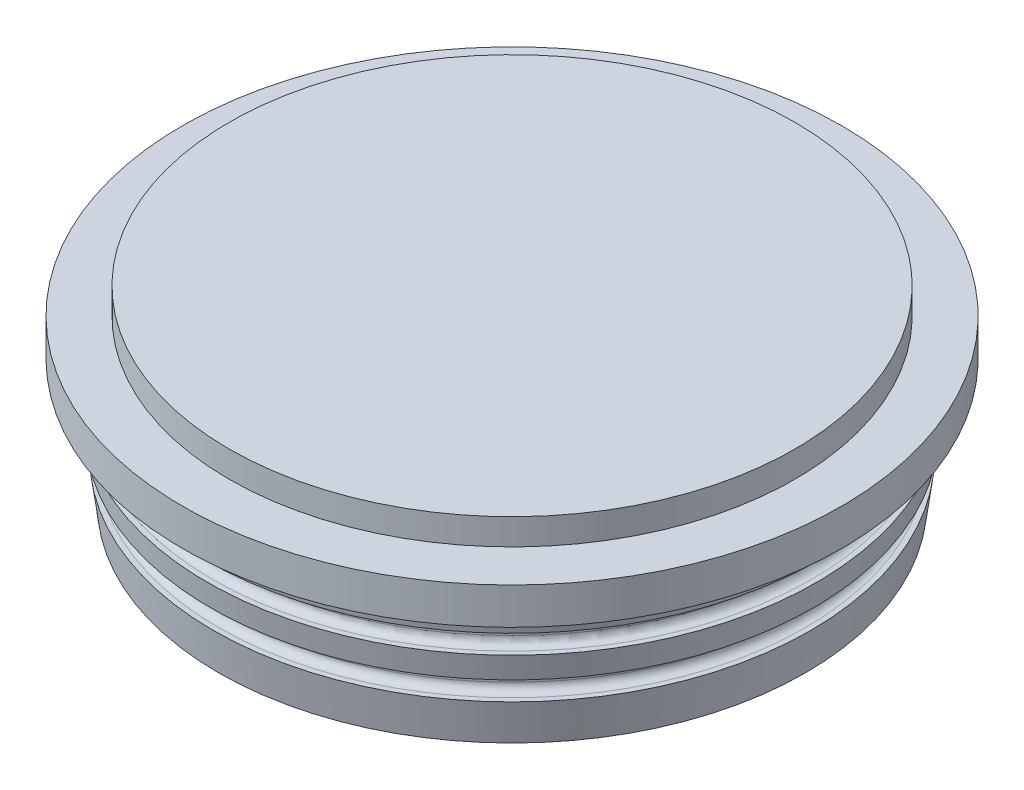
ISO-10303-21;
HEADER;
FILE_DESCRIPTION(('STEP AP214'),'2;1');
FILE_NAME('part.step','',(''),(''),'','','');
FILE_SCHEMA(('AUTOMOTIVE_DESIGN { 1 0 10303 214 1 1 1 1 }'));
ENDSEC;
DATA;
#1=APPLICATION_CONTEXT('core data for automotive mechanical design processes');
#2=APPLICATION_PROTOCOL_DEFINITION('international standard','automotive_design',2000,#1);
#3=PRODUCT_CONTEXT('',#1,'mechanical');
#4=PRODUCT('Part','Part','',(#3));
#5=PRODUCT_RELATED_PRODUCT_CATEGORY('part','',(#4));
#6=PRODUCT_DEFINITION_FORMATION('','',#4);
#7=PRODUCT_DEFINITION_CONTEXT('part definition',#1,'design');
#8=PRODUCT_DEFINITION('design','',#6,#7);
#9=PRODUCT_DEFINITION_SHAPE('','',#8);
#10=(LENGTH_UNIT() NAMED_UNIT(*) SI_UNIT(.MILLI.,.METRE.));
#11=(NAMED_UNIT(*) PLANE_ANGLE_UNIT() SI_UNIT($,.RADIAN.));
#12=(NAMED_UNIT(*) SI_UNIT($,.STERADIAN.) SOLID_ANGLE_UNIT());
#13=UNCERTAINTY_MEASURE_WITH_UNIT(LENGTH_MEASURE(1.E-05),#10,'distance_accuracy_value','');
#14=(GEOMETRIC_REPRESENTATION_CONTEXT(3) GLOBAL_UNCERTAINTY_ASSIGNED_CONTEXT((#13)) GLOBAL_UNIT_ASSIGNED_CONTEXT((#10,
#11,#12)) REPRESENTATION_CONTEXT('',''));
#15=CARTESIAN_POINT('',(0.,0.,0.));
#16=DIRECTION('',(0.,0.,1.));
#17=DIRECTION('',(1.,0.,0.));
#18=AXIS2_PLACEMENT_3D('',#15,#16,#17);
#19=CARTESIAN_POINT('',(0.,-31.,0.));
#20=DIRECTION('',(0.,1.,0.));
#21=DIRECTION('',(0.,0.,1.));
#22=AXIS2_PLACEMENT_3D('',#19,#20,#21);
#23=CONICAL_SURFACE('',#22,56.,0.130899693899576);
#24=CARTESIAN_POINT('',(0.,-23.5,0.));
#25=DIRECTION('',(0.,-1.,0.));
#26=DIRECTION('',(0.,0.,-1.));
#27=AXIS2_PLACEMENT_3D('',#24,#25,#26);
#28=CIRCLE('',#27,56.9873937319055);
#29=CARTESIAN_POINT('',(0.,-23.5,-56.9873937319055));
#30=VERTEX_POINT('',#29);
#31=EDGE_CURVE('E75',#30,#30,#28,.T.);
#32=ORIENTED_EDGE('',*,*,#31,.T.);
#33=EDGE_LOOP('',(#32));
#34=FACE_BOUND('',#33,.T.);
#35=CARTESIAN_POINT('',(0.,-31.,0.));
#36=DIRECTION('',(0.,-1.,0.));
#37=DIRECTION('',(0.,0.,-1.));
#38=AXIS2_PLACEMENT_3D('',#35,#36,#37);
#39=CIRCLE('',#38,56.);
#40=CARTESIAN_POINT('',(0.,-31.,-56.));
#41=VERTEX_POINT('',#40);
#42=EDGE_CURVE('E105',#41,#41,#39,.T.);
#43=ORIENTED_EDGE('',*,*,#42,.F.);
#44=EDGE_LOOP('',(#43));
#45=FACE_BOUND('',#44,.T.);
#46=ADVANCED_FACE('F37',(#34,#45),#23,.T.);
#47=CARTESIAN_POINT('',(56.9873937319055,-23.5,0.));
#48=DIRECTION('',(0.,1.,0.));
#49=DIRECTION('',(0.,0.,1.));
#50=AXIS2_PLACEMENT_3D('',#47,#48,#49);
#51=PLANE('',#50);
#52=CARTESIAN_POINT('',(0.,-23.5,0.));
#53=DIRECTION('',(0.,1.,0.));
#54=DIRECTION('',(0.,0.,1.));
#55=AXIS2_PLACEMENT_3D('',#52,#53,#54);
#56=CIRCLE('',#55,56.0140037222551);
#57=CARTESIAN_POINT('',(0.,-23.5,56.0140037222551));
#58=VERTEX_POINT('',#57);
#59=EDGE_CURVE('E63',#58,#58,#56,.F.);
#60=ORIENTED_EDGE('',*,*,#59,.T.);
#61=EDGE_LOOP('',(#60));
#62=FACE_BOUND('',#61,.T.);
#63=ORIENTED_EDGE('',*,*,#31,.F.);
#64=EDGE_LOOP('',(#63));
#65=FACE_BOUND('',#64,.T.);
#66=ADVANCED_FACE('F113',(#62,#65),#51,.T.);
#67=CARTESIAN_POINT('',(0.,0.,0.));
#68=DIRECTION('',(0.,-1.,0.));
#69=DIRECTION('',(0.,0.,-1.));
#70=AXIS2_PLACEMENT_3D('',#67,#68,#69);
#71=CYLINDRICAL_SURFACE('',#70,54.5140037222551);
#72=CARTESIAN_POINT('',(0.,-22.,0.));
#73=DIRECTION('',(0.,1.,0.));
#74=DIRECTION('',(0.,0.,1.));
#75=AXIS2_PLACEMENT_3D('',#72,#73,#74);
#76=CIRCLE('',#75,54.5140037222551);
#77=CARTESIAN_POINT('',(0.,-22.,54.5140037222551));
#78=VERTEX_POINT('',#77);
#79=EDGE_CURVE('E57',#78,#78,#76,.T.);
#80=ORIENTED_EDGE('',*,*,#79,.T.);
#81=EDGE_LOOP('',(#80));
#82=FACE_BOUND('',#81,.T.);
#83=CARTESIAN_POINT('',(0.,-21.,0.));
#84=DIRECTION('',(0.,-1.,0.));
#85=DIRECTION('',(0.,0.,-1.));
#86=AXIS2_PLACEMENT_3D('',#83,#84,#85);
#87=CIRCLE('',#86,54.5140037222551);
#88=CARTESIAN_POINT('',(0.,-21.,-54.5140037222551));
#89=VERTEX_POINT('',#88);
#90=EDGE_CURVE('E60',#89,#89,#87,.T.);
#91=ORIENTED_EDGE('',*,*,#90,.T.);
#92=EDGE_LOOP('',(#91));
#93=FACE_BOUND('',#92,.T.);
#94=ADVANCED_FACE('F119',(#82,#93),#71,.T.);
#95=CARTESIAN_POINT('',(54.5140037222551,-19.5,0.));
#96=DIRECTION('',(0.,-1.,0.));
#97=DIRECTION('',(0.,0.,-1.));
#98=AXIS2_PLACEMENT_3D('',#95,#96,#97);
#99=PLANE('',#98);
#100=CARTESIAN_POINT('',(0.,-19.5,0.));
#101=DIRECTION('',(0.,-1.,0.));
#102=DIRECTION('',(0.,0.,-1.));
#103=AXIS2_PLACEMENT_3D('',#100,#101,#102);
#104=CIRCLE('',#103,56.0140037222551);
#105=CARTESIAN_POINT('',(0.,-19.5,-56.0140037222551));
#106=VERTEX_POINT('',#105);
#107=EDGE_CURVE('E52',#106,#106,#104,.F.);
#108=ORIENTED_EDGE('',*,*,#107,.T.);
#109=EDGE_LOOP('',(#108));
#110=FACE_BOUND('',#109,.T.);
#111=CARTESIAN_POINT('',(0.,-19.5,0.));
#112=DIRECTION('',(0.,-1.,0.));
#113=DIRECTION('',(0.,0.,-1.));
#114=AXIS2_PLACEMENT_3D('',#111,#112,#113);
#115=CIRCLE('',#114,57.5140037222551);
#116=CARTESIAN_POINT('',(0.,-19.5,-57.5140037222551));
#117=VERTEX_POINT('',#116);
#118=EDGE_CURVE('E78',#117,#117,#115,.T.);
#119=ORIENTED_EDGE('',*,*,#118,.T.);
#120=EDGE_LOOP('',(#119));
#121=FACE_BOUND('',#120,.T.);
#122=ADVANCED_FACE('F166',(#110,#121),#99,.T.);
#123=CARTESIAN_POINT('',(0.,-19.5,0.));
#124=DIRECTION('',(0.,1.,0.));
#125=DIRECTION('',(0.,0.,1.));
#126=AXIS2_PLACEMENT_3D('',#123,#124,#125);
#127=CONICAL_SURFACE('',#126,57.5140037222551,0.130899693899575);
#128=CARTESIAN_POINT('',(0.,-15.,0.));
#129=DIRECTION('',(0.,-1.,0.));
#130=DIRECTION('',(0.,0.,-1.));
#131=AXIS2_PLACEMENT_3D('',#128,#129,#130);
#132=CIRCLE('',#131,58.1064399613983);
#133=CARTESIAN_POINT('',(0.,-15.,-58.1064399613983));
#134=VERTEX_POINT('',#133);
#135=EDGE_CURVE('E81',#134,#134,#132,.T.);
#136=ORIENTED_EDGE('',*,*,#135,.T.);
#137=EDGE_LOOP('',(#136));
#138=FACE_BOUND('',#137,.T.);
#139=ORIENTED_EDGE('',*,*,#118,.F.);
#140=EDGE_LOOP('',(#139));
#141=FACE_BOUND('',#140,.T.);
#142=ADVANCED_FACE('F159',(#138,#141),#127,.T.);
#143=CARTESIAN_POINT('',(58.1064399613983,-15.,0.));
#144=DIRECTION('',(0.,1.,0.));
#145=DIRECTION('',(0.,0.,1.));
#146=AXIS2_PLACEMENT_3D('',#143,#144,#145);
#147=PLANE('',#146);
#148=CARTESIAN_POINT('',(0.,-15.,0.));
#149=DIRECTION('',(0.,1.,0.));
#150=DIRECTION('',(0.,0.,1.));
#151=AXIS2_PLACEMENT_3D('',#148,#149,#150);
#152=CIRCLE('',#151,57.1330499517479);
#153=CARTESIAN_POINT('',(0.,-15.,57.1330499517479));
#154=VERTEX_POINT('',#153);
#155=EDGE_CURVE('E72',#154,#154,#152,.F.);
#156=ORIENTED_EDGE('',*,*,#155,.T.);
#157=EDGE_LOOP('',(#156));
#158=FACE_BOUND('',#157,.T.);
#159=ORIENTED_EDGE('',*,*,#135,.F.);
#160=EDGE_LOOP('',(#159));
#161=FACE_BOUND('',#160,.T.);
#162=ADVANCED_FACE('F149',(#158,#161),#147,.T.);
#163=CARTESIAN_POINT('',(0.,0.,0.));
#164=DIRECTION('',(0.,-1.,0.));
#165=DIRECTION('',(0.,0.,-1.));
#166=AXIS2_PLACEMENT_3D('',#163,#164,#165);
#167=CYLINDRICAL_SURFACE('',#166,55.6330499517479);
#168=CARTESIAN_POINT('',(0.,-13.5,0.));
#169=DIRECTION('',(0.,1.,0.));
#170=DIRECTION('',(0.,0.,1.));
#171=AXIS2_PLACEMENT_3D('',#168,#169,#170);
#172=CIRCLE('',#171,55.6330499517479);
#173=CARTESIAN_POINT('',(0.,-13.5,55.6330499517479));
#174=VERTEX_POINT('',#173);
#175=EDGE_CURVE('E66',#174,#174,#172,.T.);
#176=ORIENTED_EDGE('',*,*,#175,.T.);
#177=EDGE_LOOP('',(#176));
#178=FACE_BOUND('',#177,.T.);
#179=CARTESIAN_POINT('',(0.,-12.5,0.));
#180=DIRECTION('',(0.,-1.,0.));
#181=DIRECTION('',(0.,0.,-1.));
#182=AXIS2_PLACEMENT_3D('',#179,#180,#181);
#183=CIRCLE('',#182,55.6330499517479);
#184=CARTESIAN_POINT('',(0.,-12.5,-55.6330499517479));
#185=VERTEX_POINT('',#184);
#186=EDGE_CURVE('E69',#185,#185,#183,.T.);
#187=ORIENTED_EDGE('',*,*,#186,.T.);
#188=EDGE_LOOP('',(#187));
#189=FACE_BOUND('',#188,.T.);
#190=ADVANCED_FACE('F146',(#178,#189),#167,.T.);
#191=CARTESIAN_POINT('',(55.6330499517479,-11.,0.));
#192=DIRECTION('',(0.,-1.,0.));
#193=DIRECTION('',(0.,0.,-1.));
#194=AXIS2_PLACEMENT_3D('',#191,#192,#193);
#195=PLANE('',#194);
#196=CARTESIAN_POINT('',(0.,-11.,0.));
#197=DIRECTION('',(0.,-1.,0.));
#198=DIRECTION('',(0.,0.,-1.));
#199=AXIS2_PLACEMENT_3D('',#196,#197,#198);
#200=CIRCLE('',#199,57.1330499517479);
#201=CARTESIAN_POINT('',(0.,-11.,-57.1330499517479));
#202=VERTEX_POINT('',#201);
#203=EDGE_CURVE('E48',#202,#202,#200,.F.);
#204=ORIENTED_EDGE('',*,*,#203,.T.);
#205=EDGE_LOOP('',(#204));
#206=FACE_BOUND('',#205,.T.);
#207=CARTESIAN_POINT('',(0.,-11.,0.));
#208=DIRECTION('',(0.,-1.,0.));
#209=DIRECTION('',(0.,0.,-1.));
#210=AXIS2_PLACEMENT_3D('',#207,#208,#209);
#211=CIRCLE('',#210,58.6330499517479);
#212=CARTESIAN_POINT('',(0.,-11.,-58.6330499517479));
#213=VERTEX_POINT('',#212);
#214=EDGE_CURVE('E84',#213,#213,#211,.T.);
#215=ORIENTED_EDGE('',*,*,#214,.T.);
#216=EDGE_LOOP('',(#215));
#217=FACE_BOUND('',#216,.T.);
#218=ADVANCED_FACE('F148',(#206,#217),#195,.T.);
#219=CARTESIAN_POINT('',(0.,-11.,0.));
#220=DIRECTION('',(0.,1.,0.));
#221=DIRECTION('',(0.,0.,1.));
#222=AXIS2_PLACEMENT_3D('',#219,#220,#221);
#223=CONICAL_SURFACE('',#222,58.6330499517479,0.130899693899576);
#224=CARTESIAN_POINT('',(0.,-6.99999999999999,0.));
#225=DIRECTION('',(0.,-1.,0.));
#226=DIRECTION('',(0.,0.,-1.));
#227=AXIS2_PLACEMENT_3D('',#224,#225,#226);
#228=CIRCLE('',#227,59.1596599420975);
#229=CARTESIAN_POINT('',(0.,-6.99999999999999,-59.1596599420975));
#230=VERTEX_POINT('',#229);
#231=EDGE_CURVE('E87',#230,#230,#228,.T.);
#232=ORIENTED_EDGE('',*,*,#231,.T.);
#233=EDGE_LOOP('',(#232));
#234=FACE_BOUND('',#233,.T.);
#235=ORIENTED_EDGE('',*,*,#214,.F.);
#236=EDGE_LOOP('',(#235));
#237=FACE_BOUND('',#236,.T.);
#238=ADVANCED_FACE('F156',(#234,#237),#223,.T.);
#239=CARTESIAN_POINT('',(59.1596599420975,-6.99999999999999,0.));
#240=DIRECTION('',(0.,-1.,0.));
#241=DIRECTION('',(0.,0.,-1.));
#242=AXIS2_PLACEMENT_3D('',#239,#240,#241);
#243=PLANE('',#242);
#244=CARTESIAN_POINT('',(0.,-6.99999999999999,0.));
#245=DIRECTION('',(0.,-1.,0.));
#246=DIRECTION('',(0.,0.,-1.));
#247=AXIS2_PLACEMENT_3D('',#244,#245,#246);
#248=CIRCLE('',#247,62.9);
#249=CARTESIAN_POINT('',(0.,-6.99999999999999,-62.9));
#250=VERTEX_POINT('',#249);
#251=EDGE_CURVE('E90',#250,#250,#248,.T.);
#252=ORIENTED_EDGE('',*,*,#251,.T.);
#253=EDGE_LOOP('',(#252));
#254=FACE_BOUND('',#253,.T.);
#255=ORIENTED_EDGE('',*,*,#231,.F.);
#256=EDGE_LOOP('',(#255));
#257=FACE_BOUND('',#256,.T.);
#258=ADVANCED_FACE('F320',(#254,#257),#243,.T.);
#259=CARTESIAN_POINT('',(0.,0.,0.));
#260=DIRECTION('',(0.,-1.,0.));
#261=DIRECTION('',(0.,0.,-1.));
#262=AXIS2_PLACEMENT_3D('',#259,#260,#261);
#263=CYLINDRICAL_SURFACE('',#262,62.9);
#264=CARTESIAN_POINT('',(0.,0.,0.));
#265=DIRECTION('',(0.,-1.,0.));
#266=DIRECTION('',(0.,0.,-1.));
#267=AXIS2_PLACEMENT_3D('',#264,#265,#266);
#268=CIRCLE('',#267,62.9);
#269=CARTESIAN_POINT('',(0.,0.,-62.9));
#270=VERTEX_POINT('',#269);
#271=EDGE_CURVE('E93',#270,#270,#268,.T.);
#272=ORIENTED_EDGE('',*,*,#271,.T.);
#273=EDGE_LOOP('',(#272));
#274=FACE_BOUND('',#273,.T.);
#275=ORIENTED_EDGE('',*,*,#251,.F.);
#276=EDGE_LOOP('',(#275));
#277=FACE_BOUND('',#276,.T.);
#278=ADVANCED_FACE('F310',(#274,#277),#263,.T.);
#279=CARTESIAN_POINT('',(62.9,0.,0.));
#280=DIRECTION('',(0.,1.,0.));
#281=DIRECTION('',(0.,0.,1.));
#282=AXIS2_PLACEMENT_3D('',#279,#280,#281);
#283=PLANE('',#282);
#284=CARTESIAN_POINT('',(0.,0.,0.));
#285=DIRECTION('',(0.,-1.,0.));
#286=DIRECTION('',(0.,0.,-1.));
#287=AXIS2_PLACEMENT_3D('',#284,#285,#286);
#288=CIRCLE('',#287,54.);
#289=CARTESIAN_POINT('',(0.,0.,-54.));
#290=VERTEX_POINT('',#289);
#291=EDGE_CURVE('E96',#290,#290,#288,.T.);
#292=ORIENTED_EDGE('',*,*,#291,.T.);
#293=EDGE_LOOP('',(#292));
#294=FACE_BOUND('',#293,.T.);
#295=ORIENTED_EDGE('',*,*,#271,.F.);
#296=EDGE_LOOP('',(#295));
#297=FACE_BOUND('',#296,.T.);
#298=ADVANCED_FACE('F300',(#294,#297),#283,.T.);
#299=CARTESIAN_POINT('',(0.,0.,0.));
#300=DIRECTION('',(0.,-1.,0.));
#301=DIRECTION('',(0.,0.,-1.));
#302=AXIS2_PLACEMENT_3D('',#299,#300,#301);
#303=CYLINDRICAL_SURFACE('',#302,54.);
#304=CARTESIAN_POINT('',(0.,5.,0.));
#305=DIRECTION('',(0.,-1.,0.));
#306=DIRECTION('',(0.,0.,-1.));
#307=AXIS2_PLACEMENT_3D('',#304,#305,#306);
#308=CIRCLE('',#307,54.);
#309=CARTESIAN_POINT('',(0.,5.,-54.));
#310=VERTEX_POINT('',#309);
#311=EDGE_CURVE('E99',#310,#310,#308,.T.);
#312=ORIENTED_EDGE('',*,*,#311,.T.);
#313=EDGE_LOOP('',(#312));
#314=FACE_BOUND('',#313,.T.);
#315=ORIENTED_EDGE('',*,*,#291,.F.);
#316=EDGE_LOOP('',(#315));
#317=FACE_BOUND('',#316,.T.);
#318=ADVANCED_FACE('F290',(#314,#317),#303,.T.);
#319=CARTESIAN_POINT('',(54.,5.,0.));
#320=DIRECTION('',(0.,1.,0.));
#321=DIRECTION('',(0.,0.,1.));
#322=AXIS2_PLACEMENT_3D('',#319,#320,#321);
#323=PLANE('',#322);
#324=ORIENTED_EDGE('',*,*,#311,.F.);
#325=EDGE_LOOP('',(#324));
#326=FACE_BOUND('',#325,.T.);
#327=ADVANCED_FACE('F251',(#326),#323,.T.);
#328=CARTESIAN_POINT('',(0.,-6.5,0.));
#329=DIRECTION('',(0.,-1.,0.));
#330=DIRECTION('',(0.,0.,-1.));
#331=AXIS2_PLACEMENT_3D('',#328,#329,#330);
#332=PLANE('',#331);
#333=CARTESIAN_POINT('',(0.,-6.5,0.));
#334=DIRECTION('',(0.,-1.,0.));
#335=DIRECTION('',(0.,0.,-1.));
#336=AXIS2_PLACEMENT_3D('',#333,#334,#335);
#337=CIRCLE('',#336,37.);
#338=CARTESIAN_POINT('',(0.,-6.5,-37.));
#339=VERTEX_POINT('',#338);
#340=EDGE_CURVE('E44',#339,#339,#337,.T.);
#341=ORIENTED_EDGE('',*,*,#340,.T.);
#342=EDGE_LOOP('',(#341));
#343=FACE_BOUND('',#342,.T.);
#344=ADVANCED_FACE('F246',(#343),#332,.T.);
#345=CARTESIAN_POINT('',(0.,0.,0.));
#346=DIRECTION('',(0.,-1.,0.));
#347=DIRECTION('',(0.,0.,-1.));
#348=AXIS2_PLACEMENT_3D('',#345,#346,#347);
#349=CYLINDRICAL_SURFACE('',#348,47.);
#350=CARTESIAN_POINT('',(0.,-16.5,0.));
#351=DIRECTION('',(0.,-1.,0.));
#352=DIRECTION('',(0.,0.,-1.));
#353=AXIS2_PLACEMENT_3D('',#350,#351,#352);
#354=CIRCLE('',#353,47.);
#355=CARTESIAN_POINT('',(0.,-16.5,-47.));
#356=VERTEX_POINT('',#355);
#357=EDGE_CURVE('E10',#356,#356,#354,.F.);
#358=ORIENTED_EDGE('',*,*,#357,.T.);
#359=EDGE_LOOP('',(#358));
#360=FACE_BOUND('',#359,.T.);
#361=CARTESIAN_POINT('',(0.,-31.,0.));
#362=DIRECTION('',(0.,-1.,0.));
#363=DIRECTION('',(0.,0.,-1.));
#364=AXIS2_PLACEMENT_3D('',#361,#362,#363);
#365=CIRCLE('',#364,47.);
#366=CARTESIAN_POINT('',(0.,-31.,-47.));
#367=VERTEX_POINT('',#366);
#368=EDGE_CURVE('E102',#367,#367,#365,.T.);
#369=ORIENTED_EDGE('',*,*,#368,.T.);
#370=EDGE_LOOP('',(#369));
#371=FACE_BOUND('',#370,.T.);
#372=ADVANCED_FACE('F250',(#360,#371),#349,.F.);
#373=CARTESIAN_POINT('',(47.,-31.,0.));
#374=DIRECTION('',(0.,-1.,0.));
#375=DIRECTION('',(0.,0.,-1.));
#376=AXIS2_PLACEMENT_3D('',#373,#374,#375);
#377=PLANE('',#376);
#378=ORIENTED_EDGE('',*,*,#42,.T.);
#379=EDGE_LOOP('',(#378));
#380=FACE_BOUND('',#379,.T.);
#381=ORIENTED_EDGE('',*,*,#368,.F.);
#382=EDGE_LOOP('',(#381));
#383=FACE_BOUND('',#382,.T.);
#384=ADVANCED_FACE('F109',(#380,#383),#377,.T.);
#385=CARTESIAN_POINT('',(0.,-13.5,0.));
#386=DIRECTION('',(0.,1.,0.));
#387=DIRECTION('',(0.,0.,1.));
#388=AXIS2_PLACEMENT_3D('',#385,#386,#387);
#389=TOROIDAL_SURFACE('',#388,57.1330499517479,1.5);
#390=ORIENTED_EDGE('',*,*,#175,.F.);
#391=EDGE_LOOP('',(#390));
#392=FACE_BOUND('',#391,.T.);
#393=ORIENTED_EDGE('',*,*,#155,.F.);
#394=EDGE_LOOP('',(#393));
#395=FACE_BOUND('',#394,.T.);
#396=ADVANCED_FACE('F124',(#392,#395),#389,.F.);
#397=CARTESIAN_POINT('',(0.,-22.,0.));
#398=DIRECTION('',(0.,1.,0.));
#399=DIRECTION('',(0.,0.,1.));
#400=AXIS2_PLACEMENT_3D('',#397,#398,#399);
#401=TOROIDAL_SURFACE('',#400,56.0140037222551,1.5);
#402=ORIENTED_EDGE('',*,*,#79,.F.);
#403=EDGE_LOOP('',(#402));
#404=FACE_BOUND('',#403,.T.);
#405=ORIENTED_EDGE('',*,*,#59,.F.);
#406=EDGE_LOOP('',(#405));
#407=FACE_BOUND('',#406,.T.);
#408=ADVANCED_FACE('F127',(#404,#407),#401,.F.);
#409=CARTESIAN_POINT('',(0.,-21.,0.));
#410=DIRECTION('',(0.,-1.,0.));
#411=DIRECTION('',(0.,0.,-1.));
#412=AXIS2_PLACEMENT_3D('',#409,#410,#411);
#413=TOROIDAL_SURFACE('',#412,56.0140037222551,1.5);
#414=ORIENTED_EDGE('',*,*,#107,.F.);
#415=EDGE_LOOP('',(#414));
#416=FACE_BOUND('',#415,.T.);
#417=ORIENTED_EDGE('',*,*,#90,.F.);
#418=EDGE_LOOP('',(#417));
#419=FACE_BOUND('',#418,.T.);
#420=ADVANCED_FACE('F131',(#416,#419),#413,.F.);
#421=CARTESIAN_POINT('',(0.,-12.5,0.));
#422=DIRECTION('',(0.,-1.,0.));
#423=DIRECTION('',(0.,0.,-1.));
#424=AXIS2_PLACEMENT_3D('',#421,#422,#423);
#425=TOROIDAL_SURFACE('',#424,57.1330499517479,1.5);
#426=ORIENTED_EDGE('',*,*,#203,.F.);
#427=EDGE_LOOP('',(#426));
#428=FACE_BOUND('',#427,.T.);
#429=ORIENTED_EDGE('',*,*,#186,.F.);
#430=EDGE_LOOP('',(#429));
#431=FACE_BOUND('',#430,.T.);
#432=ADVANCED_FACE('F134',(#428,#431),#425,.F.);
#433=CARTESIAN_POINT('',(0.,-16.5,0.));
#434=DIRECTION('',(0.,-1.,0.));
#435=DIRECTION('',(0.,0.,-1.));
#436=AXIS2_PLACEMENT_3D('',#433,#434,#435);
#437=TOROIDAL_SURFACE('',#436,37.,10.);
#438=ORIENTED_EDGE('',*,*,#357,.F.);
#439=EDGE_LOOP('',(#438));
#440=FACE_BOUND('',#439,.T.);
#441=ORIENTED_EDGE('',*,*,#340,.F.);
#442=EDGE_LOOP('',(#441));
#443=FACE_BOUND('',#442,.T.);
#444=ADVANCED_FACE('F39',(#440,#443),#437,.F.);
#445=CLOSED_SHELL('',(#46,#66,#94,#122,#142,#162,#190,#218,#238,#258,#278,#298,#318,#327,#344,
#372,#384,#396,#408,#420,#432,#444));
#446=MANIFOLD_SOLID_BREP('B2',#445);
#447=ADVANCED_BREP_SHAPE_REPRESENTATION('',(#18,#446),#14);
#448=SHAPE_DEFINITION_REPRESENTATION(#9,#447);
ENDSEC;
END-ISO-10303-21;
